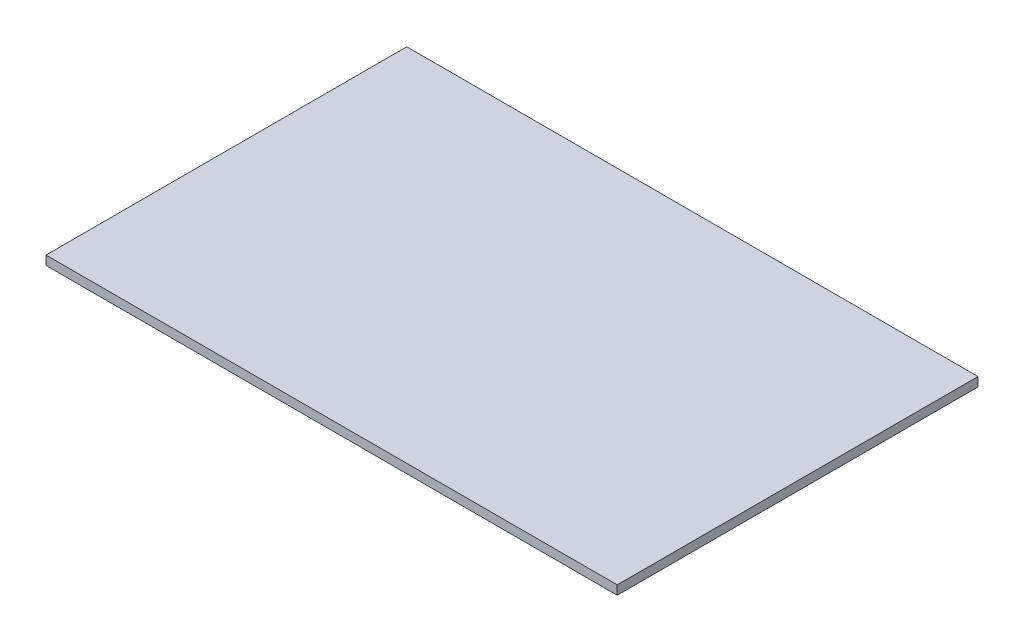
ISO-10303-21;
HEADER;
FILE_DESCRIPTION(('STEP AP214'),'2;1');
FILE_NAME('part.step','',(''),(''),'','','');
FILE_SCHEMA(('AUTOMOTIVE_DESIGN { 1 0 10303 214 1 1 1 1 }'));
ENDSEC;
DATA;
#1=APPLICATION_CONTEXT('core data for automotive mechanical design processes');
#2=APPLICATION_PROTOCOL_DEFINITION('international standard','automotive_design',2000,#1);
#3=PRODUCT_CONTEXT('',#1,'mechanical');
#4=PRODUCT('Part','Part','',(#3));
#5=PRODUCT_RELATED_PRODUCT_CATEGORY('part','',(#4));
#6=PRODUCT_DEFINITION_FORMATION('','',#4);
#7=PRODUCT_DEFINITION_CONTEXT('part definition',#1,'design');
#8=PRODUCT_DEFINITION('design','',#6,#7);
#9=PRODUCT_DEFINITION_SHAPE('','',#8);
#10=(LENGTH_UNIT() NAMED_UNIT(*) SI_UNIT(.MILLI.,.METRE.));
#11=(NAMED_UNIT(*) PLANE_ANGLE_UNIT() SI_UNIT($,.RADIAN.));
#12=(NAMED_UNIT(*) SI_UNIT($,.STERADIAN.) SOLID_ANGLE_UNIT());
#13=UNCERTAINTY_MEASURE_WITH_UNIT(LENGTH_MEASURE(1.E-05),#10,'distance_accuracy_value','');
#14=(GEOMETRIC_REPRESENTATION_CONTEXT(3) GLOBAL_UNCERTAINTY_ASSIGNED_CONTEXT((#13)) GLOBAL_UNIT_ASSIGNED_CONTEXT((#10,
#11,#12)) REPRESENTATION_CONTEXT('',''));
#15=CARTESIAN_POINT('',(0.,0.,0.));
#16=DIRECTION('',(0.,0.,1.));
#17=DIRECTION('',(1.,0.,0.));
#18=AXIS2_PLACEMENT_3D('',#15,#16,#17);
#19=CARTESIAN_POINT('',(0.,3.,60.));
#20=DIRECTION('',(1.,0.,0.));
#21=DIRECTION('',(0.,0.,-1.));
#22=AXIS2_PLACEMENT_3D('',#19,#20,#21);
#23=PLANE('',#22);
#24=DIRECTION('',(0.,0.,1.));
#25=VECTOR('',#24,1.);
#26=CARTESIAN_POINT('',(0.,0.,60.));
#27=LINE('',#26,#25);
#28=CARTESIAN_POINT('',(0.,0.,-60.));
#29=VERTEX_POINT('',#28);
#30=CARTESIAN_POINT('',(0.,0.,60.));
#31=VERTEX_POINT('',#30);
#32=EDGE_CURVE('E96',#29,#31,#27,.T.);
#33=ORIENTED_EDGE('',*,*,#32,.T.);
#34=DIRECTION('',(0.,-1.,0.));
#35=VECTOR('',#34,1.);
#36=CARTESIAN_POINT('',(0.,3.,60.));
#37=LINE('',#36,#35);
#38=CARTESIAN_POINT('',(0.,3.,60.));
#39=VERTEX_POINT('',#38);
#40=EDGE_CURVE('E11',#39,#31,#37,.T.);
#41=ORIENTED_EDGE('',*,*,#40,.F.);
#42=DIRECTION('',(0.,0.,1.));
#43=VECTOR('',#42,1.);
#44=CARTESIAN_POINT('',(0.,3.,60.));
#45=LINE('',#44,#43);
#46=CARTESIAN_POINT('',(0.,3.,-60.));
#47=VERTEX_POINT('',#46);
#48=EDGE_CURVE('E84',#47,#39,#45,.T.);
#49=ORIENTED_EDGE('',*,*,#48,.F.);
#50=DIRECTION('',(0.,-1.,0.));
#51=VECTOR('',#50,1.);
#52=CARTESIAN_POINT('',(0.,3.,-60.));
#53=LINE('',#52,#51);
#54=EDGE_CURVE('E92',#47,#29,#53,.T.);
#55=ORIENTED_EDGE('',*,*,#54,.T.);
#56=EDGE_LOOP('',(#33,#41,#49,#55));
#57=FACE_BOUND('',#56,.T.);
#58=ADVANCED_FACE('F33',(#57),#23,.F.);
#59=CARTESIAN_POINT('',(0.,3.,60.));
#60=DIRECTION('',(0.,0.,-1.));
#61=DIRECTION('',(-1.,0.,0.));
#62=AXIS2_PLACEMENT_3D('',#59,#60,#61);
#63=PLANE('',#62);
#64=DIRECTION('',(1.,0.,0.));
#65=VECTOR('',#64,1.);
#66=CARTESIAN_POINT('',(0.,0.,60.));
#67=LINE('',#66,#65);
#68=CARTESIAN_POINT('',(190.,0.,60.));
#69=VERTEX_POINT('',#68);
#70=EDGE_CURVE('E88',#31,#69,#67,.T.);
#71=ORIENTED_EDGE('',*,*,#70,.T.);
#72=DIRECTION('',(0.,-1.,0.));
#73=VECTOR('',#72,1.);
#74=CARTESIAN_POINT('',(190.,3.,60.));
#75=LINE('',#74,#73);
#76=CARTESIAN_POINT('',(190.,3.,60.));
#77=VERTEX_POINT('',#76);
#78=EDGE_CURVE('E41',#77,#69,#75,.T.);
#79=ORIENTED_EDGE('',*,*,#78,.F.);
#80=DIRECTION('',(1.,0.,0.));
#81=VECTOR('',#80,1.);
#82=CARTESIAN_POINT('',(0.,3.,60.));
#83=LINE('',#82,#81);
#84=EDGE_CURVE('E79',#39,#77,#83,.T.);
#85=ORIENTED_EDGE('',*,*,#84,.F.);
#86=ORIENTED_EDGE('',*,*,#40,.T.);
#87=EDGE_LOOP('',(#71,#79,#85,#86));
#88=FACE_BOUND('',#87,.T.);
#89=ADVANCED_FACE('F87',(#88),#63,.F.);
#90=CARTESIAN_POINT('',(190.,3.,60.));
#91=DIRECTION('',(-1.,0.,0.));
#92=DIRECTION('',(0.,0.,1.));
#93=AXIS2_PLACEMENT_3D('',#90,#91,#92);
#94=PLANE('',#93);
#95=DIRECTION('',(0.,0.,-1.));
#96=VECTOR('',#95,1.);
#97=CARTESIAN_POINT('',(190.,0.,60.));
#98=LINE('',#97,#96);
#99=CARTESIAN_POINT('',(190.,0.,-60.));
#100=VERTEX_POINT('',#99);
#101=EDGE_CURVE('E66',#69,#100,#98,.T.);
#102=ORIENTED_EDGE('',*,*,#101,.T.);
#103=DIRECTION('',(0.,-1.,0.));
#104=VECTOR('',#103,1.);
#105=CARTESIAN_POINT('',(190.,3.,-60.));
#106=LINE('',#105,#104);
#107=CARTESIAN_POINT('',(190.,3.,-60.));
#108=VERTEX_POINT('',#107);
#109=EDGE_CURVE('E89',#108,#100,#106,.T.);
#110=ORIENTED_EDGE('',*,*,#109,.F.);
#111=DIRECTION('',(0.,0.,-1.));
#112=VECTOR('',#111,1.);
#113=CARTESIAN_POINT('',(190.,3.,60.));
#114=LINE('',#113,#112);
#115=EDGE_CURVE('E82',#77,#108,#114,.T.);
#116=ORIENTED_EDGE('',*,*,#115,.F.);
#117=ORIENTED_EDGE('',*,*,#78,.T.);
#118=EDGE_LOOP('',(#102,#110,#116,#117));
#119=FACE_BOUND('',#118,.T.);
#120=ADVANCED_FACE('F90',(#119),#94,.F.);
#121=CARTESIAN_POINT('',(0.,3.,-60.));
#122=DIRECTION('',(0.,0.,1.));
#123=DIRECTION('',(1.,0.,0.));
#124=AXIS2_PLACEMENT_3D('',#121,#122,#123);
#125=PLANE('',#124);
#126=DIRECTION('',(-1.,0.,0.));
#127=VECTOR('',#126,1.);
#128=CARTESIAN_POINT('',(0.,0.,-60.));
#129=LINE('',#128,#127);
#130=EDGE_CURVE('E72',#100,#29,#129,.T.);
#131=ORIENTED_EDGE('',*,*,#130,.T.);
#132=ORIENTED_EDGE('',*,*,#54,.F.);
#133=DIRECTION('',(-1.,0.,0.));
#134=VECTOR('',#133,1.);
#135=CARTESIAN_POINT('',(0.,3.,-60.));
#136=LINE('',#135,#134);
#137=EDGE_CURVE('E49',#108,#47,#136,.T.);
#138=ORIENTED_EDGE('',*,*,#137,.F.);
#139=ORIENTED_EDGE('',*,*,#109,.T.);
#140=EDGE_LOOP('',(#131,#132,#138,#139));
#141=FACE_BOUND('',#140,.T.);
#142=ADVANCED_FACE('F103',(#141),#125,.F.);
#143=CARTESIAN_POINT('',(0.,3.,0.));
#144=DIRECTION('',(0.,-1.,0.));
#145=DIRECTION('',(0.,0.,-1.));
#146=AXIS2_PLACEMENT_3D('',#143,#144,#145);
#147=PLANE('',#146);
#148=ORIENTED_EDGE('',*,*,#48,.T.);
#149=ORIENTED_EDGE('',*,*,#84,.T.);
#150=ORIENTED_EDGE('',*,*,#115,.T.);
#151=ORIENTED_EDGE('',*,*,#137,.T.);
#152=EDGE_LOOP('',(#148,#149,#150,#151));
#153=FACE_BOUND('',#152,.T.);
#154=ADVANCED_FACE('F80',(#153),#147,.F.);
#155=CARTESIAN_POINT('',(0.,0.,0.));
#156=DIRECTION('',(0.,-1.,0.));
#157=DIRECTION('',(0.,0.,-1.));
#158=AXIS2_PLACEMENT_3D('',#155,#156,#157);
#159=PLANE('',#158);
#160=ORIENTED_EDGE('',*,*,#32,.F.);
#161=ORIENTED_EDGE('',*,*,#130,.F.);
#162=ORIENTED_EDGE('',*,*,#101,.F.);
#163=ORIENTED_EDGE('',*,*,#70,.F.);
#164=EDGE_LOOP('',(#160,#161,#162,#163));
#165=FACE_BOUND('',#164,.T.);
#166=ADVANCED_FACE('F106',(#165),#159,.T.);
#167=CLOSED_SHELL('',(#58,#89,#120,#142,#154,#166));
#168=MANIFOLD_SOLID_BREP('B2',#167);
#169=ADVANCED_BREP_SHAPE_REPRESENTATION('',(#18,#168),#14);
#170=SHAPE_DEFINITION_REPRESENTATION(#9,#169);
ENDSEC;
END-ISO-10303-21;
